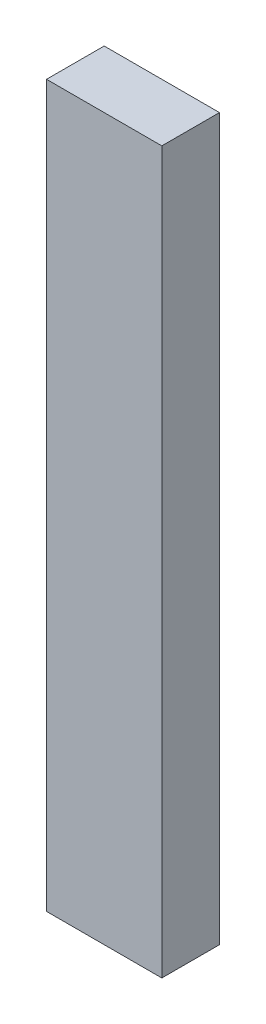
ISO-10303-21;
HEADER;
FILE_DESCRIPTION(('STEP AP214'),'2;1');
FILE_NAME('part.step','',(''),(''),'','','');
FILE_SCHEMA(('AUTOMOTIVE_DESIGN { 1 0 10303 214 1 1 1 1 }'));
ENDSEC;
DATA;
#1=APPLICATION_CONTEXT('core data for automotive mechanical design processes');
#2=APPLICATION_PROTOCOL_DEFINITION('international standard','automotive_design',2000,#1);
#3=PRODUCT_CONTEXT('',#1,'mechanical');
#4=PRODUCT('Part','Part','',(#3));
#5=PRODUCT_RELATED_PRODUCT_CATEGORY('part','',(#4));
#6=PRODUCT_DEFINITION_FORMATION('','',#4);
#7=PRODUCT_DEFINITION_CONTEXT('part definition',#1,'design');
#8=PRODUCT_DEFINITION('design','',#6,#7);
#9=PRODUCT_DEFINITION_SHAPE('','',#8);
#10=(LENGTH_UNIT() NAMED_UNIT(*) SI_UNIT(.MILLI.,.METRE.));
#11=(NAMED_UNIT(*) PLANE_ANGLE_UNIT() SI_UNIT($,.RADIAN.));
#12=(NAMED_UNIT(*) SI_UNIT($,.STERADIAN.) SOLID_ANGLE_UNIT());
#13=UNCERTAINTY_MEASURE_WITH_UNIT(LENGTH_MEASURE(1.E-05),#10,'distance_accuracy_value','');
#14=(GEOMETRIC_REPRESENTATION_CONTEXT(3) GLOBAL_UNCERTAINTY_ASSIGNED_CONTEXT((#13)) GLOBAL_UNIT_ASSIGNED_CONTEXT((#10,
#11,#12)) REPRESENTATION_CONTEXT('',''));
#15=CARTESIAN_POINT('',(0.,0.,0.));
#16=DIRECTION('',(0.,0.,1.));
#17=DIRECTION('',(1.,0.,0.));
#18=AXIS2_PLACEMENT_3D('',#15,#16,#17);
#19=CARTESIAN_POINT('',(-4.,51.,-2.00000000000001));
#20=DIRECTION('',(1.,0.,0.));
#21=DIRECTION('',(0.,0.,-1.));
#22=AXIS2_PLACEMENT_3D('',#19,#20,#21);
#23=PLANE('',#22);
#24=DIRECTION('',(0.,0.,1.));
#25=VECTOR('',#24,1.);
#26=CARTESIAN_POINT('',(-4.,1.,-2.00000000000001));
#27=LINE('',#26,#25);
#28=CARTESIAN_POINT('',(-4.,1.,-2.00000000000001));
#29=VERTEX_POINT('',#28);
#30=CARTESIAN_POINT('',(-4.,1.,1.99999999999999));
#31=VERTEX_POINT('',#30);
#32=EDGE_CURVE('E96',#29,#31,#27,.T.);
#33=ORIENTED_EDGE('',*,*,#32,.T.);
#34=DIRECTION('',(0.,-1.,0.));
#35=VECTOR('',#34,1.);
#36=CARTESIAN_POINT('',(-4.,51.,1.99999999999999));
#37=LINE('',#36,#35);
#38=CARTESIAN_POINT('',(-4.,51.,1.99999999999999));
#39=VERTEX_POINT('',#38);
#40=EDGE_CURVE('E11',#39,#31,#37,.T.);
#41=ORIENTED_EDGE('',*,*,#40,.F.);
#42=DIRECTION('',(0.,0.,1.));
#43=VECTOR('',#42,1.);
#44=CARTESIAN_POINT('',(-4.,51.,-2.00000000000001));
#45=LINE('',#44,#43);
#46=CARTESIAN_POINT('',(-4.,51.,-2.00000000000001));
#47=VERTEX_POINT('',#46);
#48=EDGE_CURVE('E84',#47,#39,#45,.T.);
#49=ORIENTED_EDGE('',*,*,#48,.F.);
#50=DIRECTION('',(0.,-1.,0.));
#51=VECTOR('',#50,1.);
#52=CARTESIAN_POINT('',(-4.,51.,-2.00000000000001));
#53=LINE('',#52,#51);
#54=EDGE_CURVE('E92',#47,#29,#53,.T.);
#55=ORIENTED_EDGE('',*,*,#54,.T.);
#56=EDGE_LOOP('',(#33,#41,#49,#55));
#57=FACE_BOUND('',#56,.T.);
#58=ADVANCED_FACE('F33',(#57),#23,.F.);
#59=CARTESIAN_POINT('',(-4.,51.,1.99999999999999));
#60=DIRECTION('',(0.,0.,-1.));
#61=DIRECTION('',(-1.,0.,0.));
#62=AXIS2_PLACEMENT_3D('',#59,#60,#61);
#63=PLANE('',#62);
#64=DIRECTION('',(1.,0.,0.));
#65=VECTOR('',#64,1.);
#66=CARTESIAN_POINT('',(-4.,1.,1.99999999999999));
#67=LINE('',#66,#65);
#68=CARTESIAN_POINT('',(3.99999999999999,1.,1.99999999999999));
#69=VERTEX_POINT('',#68);
#70=EDGE_CURVE('E88',#31,#69,#67,.T.);
#71=ORIENTED_EDGE('',*,*,#70,.T.);
#72=DIRECTION('',(0.,-1.,0.));
#73=VECTOR('',#72,1.);
#74=CARTESIAN_POINT('',(3.99999999999999,51.,1.99999999999999));
#75=LINE('',#74,#73);
#76=CARTESIAN_POINT('',(3.99999999999999,51.,1.99999999999999));
#77=VERTEX_POINT('',#76);
#78=EDGE_CURVE('E41',#77,#69,#75,.T.);
#79=ORIENTED_EDGE('',*,*,#78,.F.);
#80=DIRECTION('',(1.,0.,0.));
#81=VECTOR('',#80,1.);
#82=CARTESIAN_POINT('',(-4.,51.,1.99999999999999));
#83=LINE('',#82,#81);
#84=EDGE_CURVE('E79',#39,#77,#83,.T.);
#85=ORIENTED_EDGE('',*,*,#84,.F.);
#86=ORIENTED_EDGE('',*,*,#40,.T.);
#87=EDGE_LOOP('',(#71,#79,#85,#86));
#88=FACE_BOUND('',#87,.T.);
#89=ADVANCED_FACE('F87',(#88),#63,.F.);
#90=CARTESIAN_POINT('',(3.99999999999999,51.,-2.00000000000001));
#91=DIRECTION('',(-1.,0.,0.));
#92=DIRECTION('',(0.,0.,1.));
#93=AXIS2_PLACEMENT_3D('',#90,#91,#92);
#94=PLANE('',#93);
#95=DIRECTION('',(0.,0.,-1.));
#96=VECTOR('',#95,1.);
#97=CARTESIAN_POINT('',(3.99999999999999,1.,-2.00000000000001));
#98=LINE('',#97,#96);
#99=CARTESIAN_POINT('',(3.99999999999999,1.,-2.00000000000001));
#100=VERTEX_POINT('',#99);
#101=EDGE_CURVE('E66',#69,#100,#98,.T.);
#102=ORIENTED_EDGE('',*,*,#101,.T.);
#103=DIRECTION('',(0.,-1.,0.));
#104=VECTOR('',#103,1.);
#105=CARTESIAN_POINT('',(3.99999999999999,51.,-2.00000000000001));
#106=LINE('',#105,#104);
#107=CARTESIAN_POINT('',(3.99999999999999,51.,-2.00000000000001));
#108=VERTEX_POINT('',#107);
#109=EDGE_CURVE('E89',#108,#100,#106,.T.);
#110=ORIENTED_EDGE('',*,*,#109,.F.);
#111=DIRECTION('',(0.,0.,-1.));
#112=VECTOR('',#111,1.);
#113=CARTESIAN_POINT('',(3.99999999999999,51.,-2.00000000000001));
#114=LINE('',#113,#112);
#115=EDGE_CURVE('E82',#77,#108,#114,.T.);
#116=ORIENTED_EDGE('',*,*,#115,.F.);
#117=ORIENTED_EDGE('',*,*,#78,.T.);
#118=EDGE_LOOP('',(#102,#110,#116,#117));
#119=FACE_BOUND('',#118,.T.);
#120=ADVANCED_FACE('F90',(#119),#94,.F.);
#121=CARTESIAN_POINT('',(-4.,51.,-2.00000000000001));
#122=DIRECTION('',(0.,0.,1.));
#123=DIRECTION('',(1.,0.,0.));
#124=AXIS2_PLACEMENT_3D('',#121,#122,#123);
#125=PLANE('',#124);
#126=DIRECTION('',(-1.,0.,0.));
#127=VECTOR('',#126,1.);
#128=CARTESIAN_POINT('',(-4.,1.,-2.00000000000001));
#129=LINE('',#128,#127);
#130=EDGE_CURVE('E72',#100,#29,#129,.T.);
#131=ORIENTED_EDGE('',*,*,#130,.T.);
#132=ORIENTED_EDGE('',*,*,#54,.F.);
#133=DIRECTION('',(-1.,0.,0.));
#134=VECTOR('',#133,1.);
#135=CARTESIAN_POINT('',(-4.,51.,-2.00000000000001));
#136=LINE('',#135,#134);
#137=EDGE_CURVE('E49',#108,#47,#136,.T.);
#138=ORIENTED_EDGE('',*,*,#137,.F.);
#139=ORIENTED_EDGE('',*,*,#109,.T.);
#140=EDGE_LOOP('',(#131,#132,#138,#139));
#141=FACE_BOUND('',#140,.T.);
#142=ADVANCED_FACE('F103',(#141),#125,.F.);
#143=CARTESIAN_POINT('',(0.,51.,0.));
#144=DIRECTION('',(0.,1.,0.));
#145=DIRECTION('',(0.,0.,1.));
#146=AXIS2_PLACEMENT_3D('',#143,#144,#145);
#147=PLANE('',#146);
#148=ORIENTED_EDGE('',*,*,#48,.T.);
#149=ORIENTED_EDGE('',*,*,#84,.T.);
#150=ORIENTED_EDGE('',*,*,#115,.T.);
#151=ORIENTED_EDGE('',*,*,#137,.T.);
#152=EDGE_LOOP('',(#148,#149,#150,#151));
#153=FACE_BOUND('',#152,.T.);
#154=ADVANCED_FACE('F80',(#153),#147,.T.);
#155=CARTESIAN_POINT('',(0.,1.,0.));
#156=DIRECTION('',(0.,1.,0.));
#157=DIRECTION('',(0.,0.,1.));
#158=AXIS2_PLACEMENT_3D('',#155,#156,#157);
#159=PLANE('',#158);
#160=ORIENTED_EDGE('',*,*,#32,.F.);
#161=ORIENTED_EDGE('',*,*,#130,.F.);
#162=ORIENTED_EDGE('',*,*,#101,.F.);
#163=ORIENTED_EDGE('',*,*,#70,.F.);
#164=EDGE_LOOP('',(#160,#161,#162,#163));
#165=FACE_BOUND('',#164,.T.);
#166=ADVANCED_FACE('F106',(#165),#159,.F.);
#167=CLOSED_SHELL('',(#58,#89,#120,#142,#154,#166));
#168=MANIFOLD_SOLID_BREP('B2',#167);
#169=ADVANCED_BREP_SHAPE_REPRESENTATION('',(#18,#168),#14);
#170=SHAPE_DEFINITION_REPRESENTATION(#9,#169);
ENDSEC;
END-ISO-10303-21;
